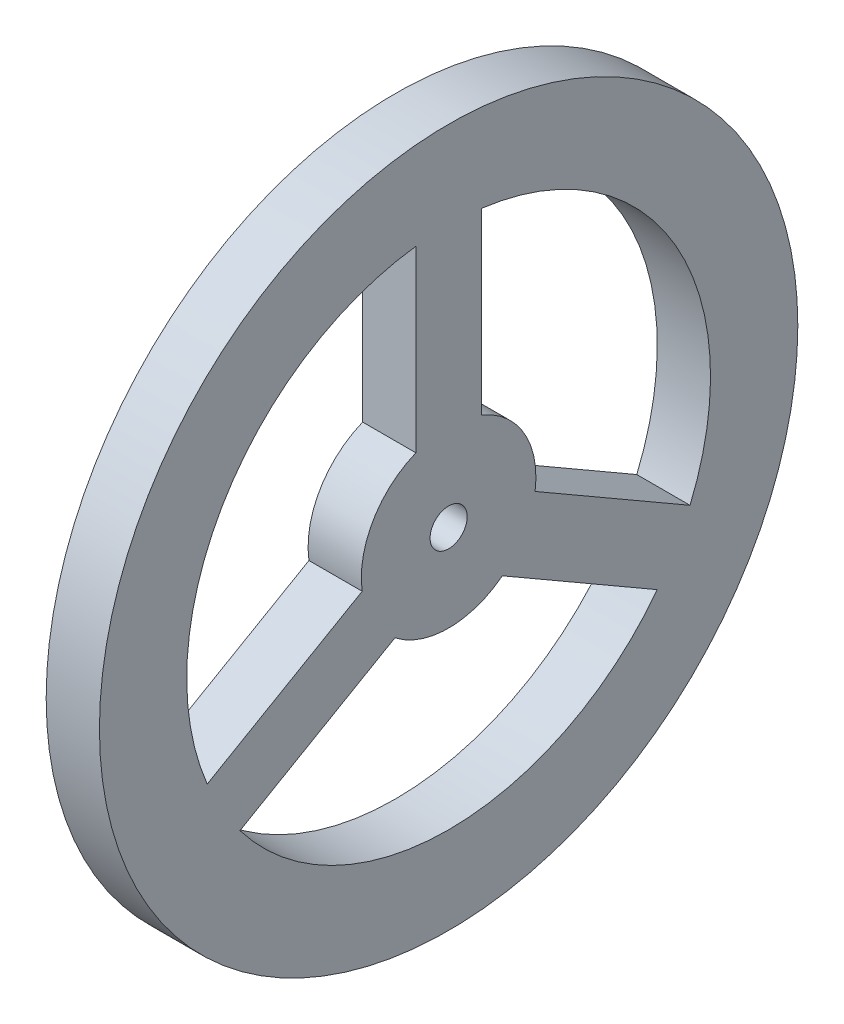
ISO-10303-21;
HEADER;
FILE_DESCRIPTION(('STEP AP214'),'2;1');
FILE_NAME('part.step','',(''),(''),'','','');
FILE_SCHEMA(('AUTOMOTIVE_DESIGN { 1 0 10303 214 1 1 1 1 }'));
ENDSEC;
DATA;
#1=APPLICATION_CONTEXT('core data for automotive mechanical design processes');
#2=APPLICATION_PROTOCOL_DEFINITION('international standard','automotive_design',2000,#1);
#3=PRODUCT_CONTEXT('',#1,'mechanical');
#4=PRODUCT('Part','Part','',(#3));
#5=PRODUCT_RELATED_PRODUCT_CATEGORY('part','',(#4));
#6=PRODUCT_DEFINITION_FORMATION('','',#4);
#7=PRODUCT_DEFINITION_CONTEXT('part definition',#1,'design');
#8=PRODUCT_DEFINITION('design','',#6,#7);
#9=PRODUCT_DEFINITION_SHAPE('','',#8);
#10=(LENGTH_UNIT() NAMED_UNIT(*) SI_UNIT(.MILLI.,.METRE.));
#11=(NAMED_UNIT(*) PLANE_ANGLE_UNIT() SI_UNIT($,.RADIAN.));
#12=(NAMED_UNIT(*) SI_UNIT($,.STERADIAN.) SOLID_ANGLE_UNIT());
#13=UNCERTAINTY_MEASURE_WITH_UNIT(LENGTH_MEASURE(1.E-05),#10,'distance_accuracy_value','');
#14=(GEOMETRIC_REPRESENTATION_CONTEXT(3) GLOBAL_UNCERTAINTY_ASSIGNED_CONTEXT((#13)) GLOBAL_UNIT_ASSIGNED_CONTEXT((#10,
#11,#12)) REPRESENTATION_CONTEXT('',''));
#15=CARTESIAN_POINT('',(0.,0.,0.));
#16=DIRECTION('',(0.,0.,1.));
#17=DIRECTION('',(1.,0.,0.));
#18=AXIS2_PLACEMENT_3D('',#15,#16,#17);
#19=CARTESIAN_POINT('',(3.0988,0.,-1.905));
#20=DIRECTION('',(0.,0.,-1.));
#21=DIRECTION('',(0.,1.,0.));
#22=AXIS2_PLACEMENT_3D('',#19,#20,#21);
#23=PLANE('',#22);
#24=DIRECTION('',(0.,-1.,0.));
#25=VECTOR('',#24,1.);
#26=CARTESIAN_POINT('',(0.,0.,-1.905));
#27=LINE('',#26,#25);
#28=CARTESIAN_POINT('',(0.,15.1204687427341,-1.905));
#29=VERTEX_POINT('',#28);
#30=CARTESIAN_POINT('',(0.,4.70928603930574,-1.905));
#31=VERTEX_POINT('',#30);
#32=EDGE_CURVE('E205',#29,#31,#27,.T.);
#33=ORIENTED_EDGE('',*,*,#32,.F.);
#34=DIRECTION('',(-1.,0.,0.));
#35=VECTOR('',#34,1.);
#36=CARTESIAN_POINT('',(3.0988,15.1204687427341,-1.905));
#37=LINE('',#36,#35);
#38=CARTESIAN_POINT('',(3.0988,15.1204687427341,-1.905));
#39=VERTEX_POINT('',#38);
#40=EDGE_CURVE('E11',#39,#29,#37,.T.);
#41=ORIENTED_EDGE('',*,*,#40,.F.);
#42=DIRECTION('',(0.,-1.,0.));
#43=VECTOR('',#42,1.);
#44=CARTESIAN_POINT('',(3.0988,0.,-1.905));
#45=LINE('',#44,#43);
#46=CARTESIAN_POINT('',(3.0988,4.70928603930574,-1.905));
#47=VERTEX_POINT('',#46);
#48=EDGE_CURVE('E156',#39,#47,#45,.T.);
#49=ORIENTED_EDGE('',*,*,#48,.T.);
#50=DIRECTION('',(-1.,0.,0.));
#51=VECTOR('',#50,1.);
#52=CARTESIAN_POINT('',(3.0988,4.70928603930574,-1.905));
#53=LINE('',#52,#51);
#54=EDGE_CURVE('E107',#47,#31,#53,.T.);
#55=ORIENTED_EDGE('',*,*,#54,.T.);
#56=EDGE_LOOP('',(#33,#41,#49,#55));
#57=FACE_BOUND('',#56,.T.);
#58=ADVANCED_FACE('F41',(#57),#23,.T.);
#59=CARTESIAN_POINT('',(3.0988,0.,0.));
#60=DIRECTION('',(-1.,0.,0.));
#61=DIRECTION('',(0.,0.,1.));
#62=AXIS2_PLACEMENT_3D('',#59,#60,#61);
#63=CYLINDRICAL_SURFACE('',#62,15.24);
#64=CARTESIAN_POINT('',(0.,0.,0.));
#65=DIRECTION('',(1.,0.,0.));
#66=DIRECTION('',(0.,0.,-1.));
#67=AXIS2_PLACEMENT_3D('',#64,#65,#66);
#68=CIRCLE('',#67,15.24);
#69=CARTESIAN_POINT('',(0.,-5.91045597715767,-14.0472100483363));
#70=VERTEX_POINT('',#69);
#71=EDGE_CURVE('E146',#70,#29,#68,.T.);
#72=ORIENTED_EDGE('',*,*,#71,.F.);
#73=DIRECTION('',(-1.,0.,0.));
#74=VECTOR('',#73,1.);
#75=CARTESIAN_POINT('',(3.0988,-5.91045597715767,-14.0472100483363));
#76=LINE('',#75,#74);
#77=CARTESIAN_POINT('',(3.0988,-5.91045597715767,-14.0472100483363));
#78=VERTEX_POINT('',#77);
#79=EDGE_CURVE('E52',#78,#70,#76,.T.);
#80=ORIENTED_EDGE('',*,*,#79,.F.);
#81=CARTESIAN_POINT('',(3.0988,0.,0.));
#82=DIRECTION('',(1.,0.,0.));
#83=DIRECTION('',(0.,0.,-1.));
#84=AXIS2_PLACEMENT_3D('',#81,#82,#83);
#85=CIRCLE('',#84,15.24);
#86=EDGE_CURVE('E144',#78,#39,#85,.T.);
#87=ORIENTED_EDGE('',*,*,#86,.T.);
#88=ORIENTED_EDGE('',*,*,#40,.T.);
#89=EDGE_LOOP('',(#72,#80,#87,#88));
#90=FACE_BOUND('',#89,.T.);
#91=ADVANCED_FACE('F143',(#90),#63,.F.);
#92=CARTESIAN_POINT('',(3.0988,1.64977839420936,-0.952499999999996));
#93=DIRECTION('',(0.,0.86602540378444,-0.499999999999998));
#94=DIRECTION('',(0.,0.499999999999998,0.86602540378444));
#95=AXIS2_PLACEMENT_3D('',#92,#93,#94);
#96=PLANE('',#95);
#97=DIRECTION('',(0.,-0.499999999999998,-0.86602540378444));
#98=VECTOR('',#97,1.);
#99=CARTESIAN_POINT('',(0.,1.64977839420936,-0.952499999999996));
#100=LINE('',#99,#98);
#101=CARTESIAN_POINT('',(0.,-0.704864625443504,-5.03086134372618));
#102=VERTEX_POINT('',#101);
#103=EDGE_CURVE('E211',#102,#70,#100,.T.);
#104=ORIENTED_EDGE('',*,*,#103,.F.);
#105=DIRECTION('',(-1.,0.,0.));
#106=VECTOR('',#105,1.);
#107=CARTESIAN_POINT('',(3.0988,-0.704864625443504,-5.03086134372618));
#108=LINE('',#107,#106);
#109=CARTESIAN_POINT('',(3.0988,-0.704864625443504,-5.03086134372618));
#110=VERTEX_POINT('',#109);
#111=EDGE_CURVE('E100',#110,#102,#108,.T.);
#112=ORIENTED_EDGE('',*,*,#111,.F.);
#113=DIRECTION('',(0.,-0.499999999999998,-0.86602540378444));
#114=VECTOR('',#113,1.);
#115=CARTESIAN_POINT('',(3.0988,1.64977839420936,-0.952499999999996));
#116=LINE('',#115,#114);
#117=EDGE_CURVE('E155',#110,#78,#116,.T.);
#118=ORIENTED_EDGE('',*,*,#117,.T.);
#119=ORIENTED_EDGE('',*,*,#79,.T.);
#120=EDGE_LOOP('',(#104,#112,#118,#119));
#121=FACE_BOUND('',#120,.T.);
#122=ADVANCED_FACE('F159',(#121),#96,.T.);
#123=CARTESIAN_POINT('',(3.0988,-1.64977839420936,-0.952499999999997));
#124=DIRECTION('',(0.,-0.86602540378444,-0.499999999999998));
#125=DIRECTION('',(0.,0.499999999999998,-0.86602540378444));
#126=AXIS2_PLACEMENT_3D('',#123,#124,#125);
#127=PLANE('',#126);
#128=DIRECTION('',(0.,-0.499999999999998,0.86602540378444));
#129=VECTOR('',#128,1.);
#130=CARTESIAN_POINT('',(0.,-1.64977839420936,-0.952499999999997));
#131=LINE('',#130,#129);
#132=CARTESIAN_POINT('',(0.,-4.00442141386222,3.12586134372619));
#133=VERTEX_POINT('',#132);
#134=CARTESIAN_POINT('',(0.,-9.2100127655764,12.1422100483363));
#135=VERTEX_POINT('',#134);
#136=EDGE_CURVE('E189',#133,#135,#131,.T.);
#137=ORIENTED_EDGE('',*,*,#136,.F.);
#138=DIRECTION('',(-1.,0.,0.));
#139=VECTOR('',#138,1.);
#140=CARTESIAN_POINT('',(3.0988,-4.00442141386222,3.12586134372619));
#141=LINE('',#140,#139);
#142=CARTESIAN_POINT('',(3.0988,-4.00442141386222,3.12586134372619));
#143=VERTEX_POINT('',#142);
#144=EDGE_CURVE('E228',#143,#133,#141,.T.);
#145=ORIENTED_EDGE('',*,*,#144,.F.);
#146=DIRECTION('',(0.,-0.499999999999998,0.86602540378444));
#147=VECTOR('',#146,1.);
#148=CARTESIAN_POINT('',(3.0988,-1.64977839420936,-0.952499999999997));
#149=LINE('',#148,#147);
#150=CARTESIAN_POINT('',(3.0988,-9.2100127655764,12.1422100483363));
#151=VERTEX_POINT('',#150);
#152=EDGE_CURVE('E278',#143,#151,#149,.T.);
#153=ORIENTED_EDGE('',*,*,#152,.T.);
#154=DIRECTION('',(-1.,0.,0.));
#155=VECTOR('',#154,1.);
#156=CARTESIAN_POINT('',(3.0988,-9.2100127655764,12.1422100483363));
#157=LINE('',#156,#155);
#158=EDGE_CURVE('E231',#151,#135,#157,.T.);
#159=ORIENTED_EDGE('',*,*,#158,.T.);
#160=EDGE_LOOP('',(#137,#145,#153,#159));
#161=FACE_BOUND('',#160,.T.);
#162=ADVANCED_FACE('F327',(#161),#127,.T.);
#163=CARTESIAN_POINT('',(3.0988,0.,0.));
#164=DIRECTION('',(-1.,0.,0.));
#165=DIRECTION('',(0.,0.,1.));
#166=AXIS2_PLACEMENT_3D('',#163,#164,#165);
#167=CYLINDRICAL_SURFACE('',#166,5.08);
#168=CARTESIAN_POINT('',(0.,0.,0.));
#169=DIRECTION('',(1.,0.,0.));
#170=DIRECTION('',(0.,0.,-1.));
#171=AXIS2_PLACEMENT_3D('',#168,#169,#170);
#172=CIRCLE('',#171,5.08);
#173=CARTESIAN_POINT('',(0.,-4.00442141386222,-3.12586134372619));
#174=VERTEX_POINT('',#173);
#175=EDGE_CURVE('E193',#133,#174,#172,.T.);
#176=ORIENTED_EDGE('',*,*,#175,.T.);
#177=DIRECTION('',(-1.,0.,0.));
#178=VECTOR('',#177,1.);
#179=CARTESIAN_POINT('',(3.0988,-4.00442141386222,-3.12586134372619));
#180=LINE('',#179,#178);
#181=CARTESIAN_POINT('',(3.0988,-4.00442141386222,-3.12586134372619));
#182=VERTEX_POINT('',#181);
#183=EDGE_CURVE('E237',#182,#174,#180,.T.);
#184=ORIENTED_EDGE('',*,*,#183,.F.);
#185=CARTESIAN_POINT('',(3.0988,0.,0.));
#186=DIRECTION('',(1.,0.,0.));
#187=DIRECTION('',(0.,0.,-1.));
#188=AXIS2_PLACEMENT_3D('',#185,#186,#187);
#189=CIRCLE('',#188,5.08);
#190=EDGE_CURVE('E286',#143,#182,#189,.T.);
#191=ORIENTED_EDGE('',*,*,#190,.F.);
#192=ORIENTED_EDGE('',*,*,#144,.T.);
#193=EDGE_LOOP('',(#176,#184,#191,#192));
#194=FACE_BOUND('',#193,.T.);
#195=ADVANCED_FACE('F323',(#194),#167,.T.);
#196=CARTESIAN_POINT('',(3.0988,-1.64977839420936,0.952499999999996));
#197=DIRECTION('',(0.,0.86602540378444,-0.499999999999998));
#198=DIRECTION('',(0.,0.499999999999998,0.86602540378444));
#199=AXIS2_PLACEMENT_3D('',#196,#197,#198);
#200=PLANE('',#199);
#201=DIRECTION('',(0.,-0.499999999999998,-0.86602540378444));
#202=VECTOR('',#201,1.);
#203=CARTESIAN_POINT('',(0.,-1.64977839420936,0.952499999999996));
#204=LINE('',#203,#202);
#205=CARTESIAN_POINT('',(0.,-9.21001276557639,-12.1422100483363));
#206=VERTEX_POINT('',#205);
#207=EDGE_CURVE('E197',#174,#206,#204,.T.);
#208=ORIENTED_EDGE('',*,*,#207,.T.);
#209=DIRECTION('',(-1.,0.,0.));
#210=VECTOR('',#209,1.);
#211=CARTESIAN_POINT('',(3.0988,-9.21001276557639,-12.1422100483363));
#212=LINE('',#211,#210);
#213=CARTESIAN_POINT('',(3.0988,-9.21001276557639,-12.1422100483363));
#214=VERTEX_POINT('',#213);
#215=EDGE_CURVE('E234',#214,#206,#212,.T.);
#216=ORIENTED_EDGE('',*,*,#215,.F.);
#217=DIRECTION('',(0.,-0.499999999999998,-0.86602540378444));
#218=VECTOR('',#217,1.);
#219=CARTESIAN_POINT('',(3.0988,-1.64977839420936,0.952499999999996));
#220=LINE('',#219,#218);
#221=EDGE_CURVE('E290',#182,#214,#220,.T.);
#222=ORIENTED_EDGE('',*,*,#221,.F.);
#223=ORIENTED_EDGE('',*,*,#183,.T.);
#224=EDGE_LOOP('',(#208,#216,#222,#223));
#225=FACE_BOUND('',#224,.T.);
#226=ADVANCED_FACE('F320',(#225),#200,.F.);
#227=CARTESIAN_POINT('',(3.0988,0.,0.));
#228=DIRECTION('',(-1.,0.,0.));
#229=DIRECTION('',(0.,0.,1.));
#230=AXIS2_PLACEMENT_3D('',#227,#228,#229);
#231=CYLINDRICAL_SURFACE('',#230,15.24);
#232=CARTESIAN_POINT('',(0.,0.,0.));
#233=DIRECTION('',(1.,0.,0.));
#234=DIRECTION('',(0.,0.,-1.));
#235=AXIS2_PLACEMENT_3D('',#232,#233,#234);
#236=CIRCLE('',#235,15.24);
#237=CARTESIAN_POINT('',(0.,15.1204687427341,1.905));
#238=VERTEX_POINT('',#237);
#239=CARTESIAN_POINT('',(0.,-5.91045597715768,14.0472100483363));
#240=VERTEX_POINT('',#239);
#241=EDGE_CURVE('E175',#238,#240,#236,.T.);
#242=ORIENTED_EDGE('',*,*,#241,.F.);
#243=DIRECTION('',(-1.,0.,0.));
#244=VECTOR('',#243,1.);
#245=CARTESIAN_POINT('',(3.0988,15.1204687427341,1.905));
#246=LINE('',#245,#244);
#247=CARTESIAN_POINT('',(3.0988,15.1204687427341,1.905));
#248=VERTEX_POINT('',#247);
#249=EDGE_CURVE('E45',#248,#238,#246,.T.);
#250=ORIENTED_EDGE('',*,*,#249,.F.);
#251=CARTESIAN_POINT('',(3.0988,0.,0.));
#252=DIRECTION('',(1.,0.,0.));
#253=DIRECTION('',(0.,0.,-1.));
#254=AXIS2_PLACEMENT_3D('',#251,#252,#253);
#255=CIRCLE('',#254,15.24);
#256=CARTESIAN_POINT('',(3.0988,-5.91045597715768,14.0472100483363));
#257=VERTEX_POINT('',#256);
#258=EDGE_CURVE('E225',#248,#257,#255,.T.);
#259=ORIENTED_EDGE('',*,*,#258,.T.);
#260=DIRECTION('',(-1.,0.,0.));
#261=VECTOR('',#260,1.);
#262=CARTESIAN_POINT('',(3.0988,-5.91045597715768,14.0472100483363));
#263=LINE('',#262,#261);
#264=EDGE_CURVE('E174',#257,#240,#263,.T.);
#265=ORIENTED_EDGE('',*,*,#264,.T.);
#266=EDGE_LOOP('',(#242,#250,#259,#265));
#267=FACE_BOUND('',#266,.T.);
#268=ADVANCED_FACE('F43',(#267),#231,.F.);
#269=CARTESIAN_POINT('',(3.0988,0.,1.905));
#270=DIRECTION('',(0.,0.,-1.));
#271=DIRECTION('',(0.,1.,0.));
#272=AXIS2_PLACEMENT_3D('',#269,#270,#271);
#273=PLANE('',#272);
#274=DIRECTION('',(0.,-1.,0.));
#275=VECTOR('',#274,1.);
#276=CARTESIAN_POINT('',(0.,0.,1.905));
#277=LINE('',#276,#275);
#278=CARTESIAN_POINT('',(0.,4.70928603930575,1.905));
#279=VERTEX_POINT('',#278);
#280=EDGE_CURVE('E179',#238,#279,#277,.T.);
#281=ORIENTED_EDGE('',*,*,#280,.T.);
#282=DIRECTION('',(-1.,0.,0.));
#283=VECTOR('',#282,1.);
#284=CARTESIAN_POINT('',(3.0988,4.70928603930575,1.905));
#285=LINE('',#284,#283);
#286=CARTESIAN_POINT('',(3.0988,4.70928603930575,1.905));
#287=VERTEX_POINT('',#286);
#288=EDGE_CURVE('E248',#287,#279,#285,.T.);
#289=ORIENTED_EDGE('',*,*,#288,.F.);
#290=DIRECTION('',(0.,-1.,0.));
#291=VECTOR('',#290,1.);
#292=CARTESIAN_POINT('',(3.0988,0.,1.905));
#293=LINE('',#292,#291);
#294=EDGE_CURVE('E259',#248,#287,#293,.T.);
#295=ORIENTED_EDGE('',*,*,#294,.F.);
#296=ORIENTED_EDGE('',*,*,#249,.T.);
#297=EDGE_LOOP('',(#281,#289,#295,#296));
#298=FACE_BOUND('',#297,.T.);
#299=ADVANCED_FACE('F258',(#298),#273,.F.);
#300=CARTESIAN_POINT('',(3.0988,0.,0.));
#301=DIRECTION('',(-1.,0.,0.));
#302=DIRECTION('',(0.,0.,1.));
#303=AXIS2_PLACEMENT_3D('',#300,#301,#302);
#304=CYLINDRICAL_SURFACE('',#303,5.08);
#305=CARTESIAN_POINT('',(0.,0.,0.));
#306=DIRECTION('',(1.,0.,0.));
#307=DIRECTION('',(0.,0.,-1.));
#308=AXIS2_PLACEMENT_3D('',#305,#306,#307);
#309=CIRCLE('',#308,5.08);
#310=CARTESIAN_POINT('',(0.,-0.704864625443507,5.03086134372618));
#311=VERTEX_POINT('',#310);
#312=EDGE_CURVE('E182',#279,#311,#309,.T.);
#313=ORIENTED_EDGE('',*,*,#312,.T.);
#314=DIRECTION('',(-1.,0.,0.));
#315=VECTOR('',#314,1.);
#316=CARTESIAN_POINT('',(3.0988,-0.704864625443507,5.03086134372618));
#317=LINE('',#316,#315);
#318=CARTESIAN_POINT('',(3.0988,-0.704864625443507,5.03086134372618));
#319=VERTEX_POINT('',#318);
#320=EDGE_CURVE('E245',#319,#311,#317,.T.);
#321=ORIENTED_EDGE('',*,*,#320,.F.);
#322=CARTESIAN_POINT('',(3.0988,0.,0.));
#323=DIRECTION('',(1.,0.,0.));
#324=DIRECTION('',(0.,0.,-1.));
#325=AXIS2_PLACEMENT_3D('',#322,#323,#324);
#326=CIRCLE('',#325,5.08);
#327=EDGE_CURVE('E272',#287,#319,#326,.T.);
#328=ORIENTED_EDGE('',*,*,#327,.F.);
#329=ORIENTED_EDGE('',*,*,#288,.T.);
#330=EDGE_LOOP('',(#313,#321,#328,#329));
#331=FACE_BOUND('',#330,.T.);
#332=ADVANCED_FACE('F271',(#331),#304,.T.);
#333=CARTESIAN_POINT('',(3.0988,0.,0.));
#334=DIRECTION('',(-1.,0.,0.));
#335=DIRECTION('',(0.,0.,1.));
#336=AXIS2_PLACEMENT_3D('',#333,#334,#335);
#337=CYLINDRICAL_SURFACE('',#336,20.32);
#338=CARTESIAN_POINT('',(3.0988,0.,0.));
#339=DIRECTION('',(1.,0.,0.));
#340=DIRECTION('',(0.,0.,-1.));
#341=AXIS2_PLACEMENT_3D('',#338,#339,#340);
#342=CIRCLE('',#341,20.32);
#343=CARTESIAN_POINT('',(3.0988,0.,-20.32));
#344=VERTEX_POINT('',#343);
#345=EDGE_CURVE('E163',#344,#344,#342,.T.);
#346=ORIENTED_EDGE('',*,*,#345,.F.);
#347=EDGE_LOOP('',(#346));
#348=FACE_BOUND('',#347,.T.);
#349=CARTESIAN_POINT('',(0.,0.,0.));
#350=DIRECTION('',(1.,0.,0.));
#351=DIRECTION('',(0.,0.,-1.));
#352=AXIS2_PLACEMENT_3D('',#349,#350,#351);
#353=CIRCLE('',#352,20.32);
#354=CARTESIAN_POINT('',(0.,0.,-20.32));
#355=VERTEX_POINT('',#354);
#356=EDGE_CURVE('E217',#355,#355,#353,.T.);
#357=ORIENTED_EDGE('',*,*,#356,.T.);
#358=EDGE_LOOP('',(#357));
#359=FACE_BOUND('',#358,.T.);
#360=ADVANCED_FACE('F302',(#348,#359),#337,.T.);
#361=CARTESIAN_POINT('',(3.0988,0.,0.));
#362=DIRECTION('',(-1.,0.,0.));
#363=DIRECTION('',(0.,0.,1.));
#364=AXIS2_PLACEMENT_3D('',#361,#362,#363);
#365=CYLINDRICAL_SURFACE('',#364,5.08);
#366=CARTESIAN_POINT('',(0.,0.,0.));
#367=DIRECTION('',(1.,0.,0.));
#368=DIRECTION('',(0.,0.,-1.));
#369=AXIS2_PLACEMENT_3D('',#366,#367,#368);
#370=CIRCLE('',#369,5.08);
#371=EDGE_CURVE('E214',#102,#31,#370,.T.);
#372=ORIENTED_EDGE('',*,*,#371,.T.);
#373=ORIENTED_EDGE('',*,*,#54,.F.);
#374=CARTESIAN_POINT('',(3.0988,0.,0.));
#375=DIRECTION('',(1.,0.,0.));
#376=DIRECTION('',(0.,0.,-1.));
#377=AXIS2_PLACEMENT_3D('',#374,#375,#376);
#378=CIRCLE('',#377,5.08);
#379=EDGE_CURVE('E61',#110,#47,#378,.T.);
#380=ORIENTED_EDGE('',*,*,#379,.F.);
#381=ORIENTED_EDGE('',*,*,#111,.T.);
#382=EDGE_LOOP('',(#372,#373,#380,#381));
#383=FACE_BOUND('',#382,.T.);
#384=ADVANCED_FACE('F299',(#383),#365,.T.);
#385=CARTESIAN_POINT('',(3.0988,0.,0.));
#386=DIRECTION('',(-1.,0.,0.));
#387=DIRECTION('',(0.,0.,1.));
#388=AXIS2_PLACEMENT_3D('',#385,#386,#387);
#389=CYLINDRICAL_SURFACE('',#388,15.24);
#390=CARTESIAN_POINT('',(0.,0.,0.));
#391=DIRECTION('',(1.,0.,0.));
#392=DIRECTION('',(0.,0.,-1.));
#393=AXIS2_PLACEMENT_3D('',#390,#391,#392);
#394=CIRCLE('',#393,15.24);
#395=EDGE_CURVE('E201',#135,#206,#394,.T.);
#396=ORIENTED_EDGE('',*,*,#395,.F.);
#397=ORIENTED_EDGE('',*,*,#158,.F.);
#398=CARTESIAN_POINT('',(3.0988,0.,0.));
#399=DIRECTION('',(1.,0.,0.));
#400=DIRECTION('',(0.,0.,-1.));
#401=AXIS2_PLACEMENT_3D('',#398,#399,#400);
#402=CIRCLE('',#401,15.24);
#403=EDGE_CURVE('E293',#151,#214,#402,.T.);
#404=ORIENTED_EDGE('',*,*,#403,.T.);
#405=ORIENTED_EDGE('',*,*,#215,.T.);
#406=EDGE_LOOP('',(#396,#397,#404,#405));
#407=FACE_BOUND('',#406,.T.);
#408=ADVANCED_FACE('F301',(#407),#389,.F.);
#409=CARTESIAN_POINT('',(3.0988,1.64977839420936,0.952499999999997));
#410=DIRECTION('',(0.,-0.86602540378444,-0.499999999999998));
#411=DIRECTION('',(0.,0.499999999999998,-0.86602540378444));
#412=AXIS2_PLACEMENT_3D('',#409,#410,#411);
#413=PLANE('',#412);
#414=DIRECTION('',(0.,-0.499999999999998,0.86602540378444));
#415=VECTOR('',#414,1.);
#416=CARTESIAN_POINT('',(0.,1.64977839420936,0.952499999999997));
#417=LINE('',#416,#415);
#418=EDGE_CURVE('E185',#311,#240,#417,.T.);
#419=ORIENTED_EDGE('',*,*,#418,.T.);
#420=ORIENTED_EDGE('',*,*,#264,.F.);
#421=DIRECTION('',(0.,-0.499999999999998,0.86602540378444));
#422=VECTOR('',#421,1.);
#423=CARTESIAN_POINT('',(3.0988,1.64977839420936,0.952499999999997));
#424=LINE('',#423,#422);
#425=EDGE_CURVE('E270',#319,#257,#424,.T.);
#426=ORIENTED_EDGE('',*,*,#425,.F.);
#427=ORIENTED_EDGE('',*,*,#320,.T.);
#428=EDGE_LOOP('',(#419,#420,#426,#427));
#429=FACE_BOUND('',#428,.T.);
#430=ADVANCED_FACE('F268',(#429),#413,.F.);
#431=CARTESIAN_POINT('',(3.0988,0.,0.));
#432=DIRECTION('',(-1.,0.,0.));
#433=DIRECTION('',(0.,0.,1.));
#434=AXIS2_PLACEMENT_3D('',#431,#432,#433);
#435=CYLINDRICAL_SURFACE('',#434,1.0795);
#436=CARTESIAN_POINT('',(3.0988,0.,0.));
#437=DIRECTION('',(1.,0.,0.));
#438=DIRECTION('',(0.,0.,-1.));
#439=AXIS2_PLACEMENT_3D('',#436,#437,#438);
#440=CIRCLE('',#439,1.0795);
#441=CARTESIAN_POINT('',(3.0988,0.,-1.0795));
#442=VERTEX_POINT('',#441);
#443=EDGE_CURVE('E170',#442,#442,#440,.T.);
#444=ORIENTED_EDGE('',*,*,#443,.T.);
#445=EDGE_LOOP('',(#444));
#446=FACE_BOUND('',#445,.T.);
#447=CARTESIAN_POINT('',(0.,0.,0.));
#448=DIRECTION('',(1.,0.,0.));
#449=DIRECTION('',(0.,0.,-1.));
#450=AXIS2_PLACEMENT_3D('',#447,#448,#449);
#451=CIRCLE('',#450,1.0795);
#452=CARTESIAN_POINT('',(0.,0.,-1.0795));
#453=VERTEX_POINT('',#452);
#454=EDGE_CURVE('E221',#453,#453,#451,.T.);
#455=ORIENTED_EDGE('',*,*,#454,.F.);
#456=EDGE_LOOP('',(#455));
#457=FACE_BOUND('',#456,.T.);
#458=ADVANCED_FACE('F334',(#446,#457),#435,.F.);
#459=CARTESIAN_POINT('',(3.0988,0.,0.));
#460=DIRECTION('',(1.,0.,0.));
#461=DIRECTION('',(0.,0.,-1.));
#462=AXIS2_PLACEMENT_3D('',#459,#460,#461);
#463=PLANE('',#462);
#464=ORIENTED_EDGE('',*,*,#258,.F.);
#465=ORIENTED_EDGE('',*,*,#294,.T.);
#466=ORIENTED_EDGE('',*,*,#327,.T.);
#467=ORIENTED_EDGE('',*,*,#425,.T.);
#468=EDGE_LOOP('',(#464,#465,#466,#467));
#469=FACE_BOUND('',#468,.T.);
#470=ORIENTED_EDGE('',*,*,#152,.F.);
#471=ORIENTED_EDGE('',*,*,#190,.T.);
#472=ORIENTED_EDGE('',*,*,#221,.T.);
#473=ORIENTED_EDGE('',*,*,#403,.F.);
#474=EDGE_LOOP('',(#470,#471,#472,#473));
#475=FACE_BOUND('',#474,.T.);
#476=ORIENTED_EDGE('',*,*,#48,.F.);
#477=ORIENTED_EDGE('',*,*,#86,.F.);
#478=ORIENTED_EDGE('',*,*,#117,.F.);
#479=ORIENTED_EDGE('',*,*,#379,.T.);
#480=EDGE_LOOP('',(#476,#477,#478,#479));
#481=FACE_BOUND('',#480,.T.);
#482=ORIENTED_EDGE('',*,*,#345,.T.);
#483=EDGE_LOOP('',(#482));
#484=FACE_BOUND('',#483,.T.);
#485=ORIENTED_EDGE('',*,*,#443,.F.);
#486=EDGE_LOOP('',(#485));
#487=FACE_BOUND('',#486,.T.);
#488=ADVANCED_FACE('F153',(#469,#475,#481,#484,#487),#463,.T.);
#489=CARTESIAN_POINT('',(0.,0.,0.));
#490=DIRECTION('',(1.,0.,0.));
#491=DIRECTION('',(0.,0.,-1.));
#492=AXIS2_PLACEMENT_3D('',#489,#490,#491);
#493=PLANE('',#492);
#494=ORIENTED_EDGE('',*,*,#241,.T.);
#495=ORIENTED_EDGE('',*,*,#418,.F.);
#496=ORIENTED_EDGE('',*,*,#312,.F.);
#497=ORIENTED_EDGE('',*,*,#280,.F.);
#498=EDGE_LOOP('',(#494,#495,#496,#497));
#499=FACE_BOUND('',#498,.T.);
#500=ORIENTED_EDGE('',*,*,#136,.T.);
#501=ORIENTED_EDGE('',*,*,#395,.T.);
#502=ORIENTED_EDGE('',*,*,#207,.F.);
#503=ORIENTED_EDGE('',*,*,#175,.F.);
#504=EDGE_LOOP('',(#500,#501,#502,#503));
#505=FACE_BOUND('',#504,.T.);
#506=ORIENTED_EDGE('',*,*,#32,.T.);
#507=ORIENTED_EDGE('',*,*,#371,.F.);
#508=ORIENTED_EDGE('',*,*,#103,.T.);
#509=ORIENTED_EDGE('',*,*,#71,.T.);
#510=EDGE_LOOP('',(#506,#507,#508,#509));
#511=FACE_BOUND('',#510,.T.);
#512=ORIENTED_EDGE('',*,*,#356,.F.);
#513=EDGE_LOOP('',(#512));
#514=FACE_BOUND('',#513,.T.);
#515=ORIENTED_EDGE('',*,*,#454,.T.);
#516=EDGE_LOOP('',(#515));
#517=FACE_BOUND('',#516,.T.);
#518=ADVANCED_FACE('F262',(#499,#505,#511,#514,#517),#493,.F.);
#519=CLOSED_SHELL('',(#58,#91,#122,#162,#195,#226,#268,#299,#332,#360,#384,#408,#430,#458,#488,#518));
#520=MANIFOLD_SOLID_BREP('B2',#519);
#521=ADVANCED_BREP_SHAPE_REPRESENTATION('',(#18,#520),#14);
#522=SHAPE_DEFINITION_REPRESENTATION(#9,#521);
ENDSEC;
END-ISO-10303-21;
